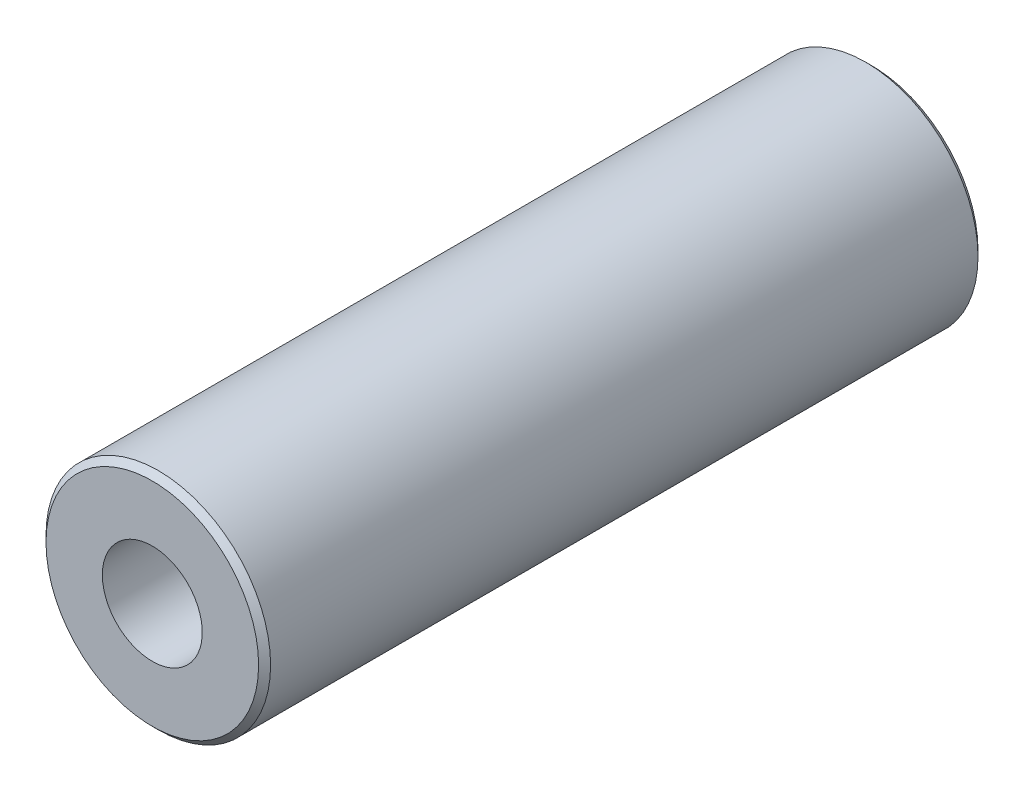
ISO-10303-21;
HEADER;
FILE_DESCRIPTION(('STEP AP214'),'2;1');
FILE_NAME('part.step','',(''),(''),'','','');
FILE_SCHEMA(('AUTOMOTIVE_DESIGN { 1 0 10303 214 1 1 1 1 }'));
ENDSEC;
DATA;
#1=APPLICATION_CONTEXT('core data for automotive mechanical design processes');
#2=APPLICATION_PROTOCOL_DEFINITION('international standard','automotive_design',2000,#1);
#3=PRODUCT_CONTEXT('',#1,'mechanical');
#4=PRODUCT('Part','Part','',(#3));
#5=PRODUCT_RELATED_PRODUCT_CATEGORY('part','',(#4));
#6=PRODUCT_DEFINITION_FORMATION('','',#4);
#7=PRODUCT_DEFINITION_CONTEXT('part definition',#1,'design');
#8=PRODUCT_DEFINITION('design','',#6,#7);
#9=PRODUCT_DEFINITION_SHAPE('','',#8);
#10=(LENGTH_UNIT() NAMED_UNIT(*) SI_UNIT(.MILLI.,.METRE.));
#11=(NAMED_UNIT(*) PLANE_ANGLE_UNIT() SI_UNIT($,.RADIAN.));
#12=(NAMED_UNIT(*) SI_UNIT($,.STERADIAN.) SOLID_ANGLE_UNIT());
#13=UNCERTAINTY_MEASURE_WITH_UNIT(LENGTH_MEASURE(1.E-05),#10,'distance_accuracy_value','');
#14=(GEOMETRIC_REPRESENTATION_CONTEXT(3) GLOBAL_UNCERTAINTY_ASSIGNED_CONTEXT((#13)) GLOBAL_UNIT_ASSIGNED_CONTEXT((#10,
#11,#12)) REPRESENTATION_CONTEXT('',''));
#15=CARTESIAN_POINT('',(0.,0.,0.));
#16=DIRECTION('',(0.,0.,1.));
#17=DIRECTION('',(1.,0.,0.));
#18=AXIS2_PLACEMENT_3D('',#15,#16,#17);
#19=CARTESIAN_POINT('',(0.,0.,22.86));
#20=DIRECTION('',(0.,0.,0.999999999999999));
#21=DIRECTION('',(0.999999999999998,0.,0.));
#22=AXIS2_PLACEMENT_3D('',#19,#20,#21);
#23=PLANE('',#22);
#24=CARTESIAN_POINT('',(0.,0.,22.86));
#25=DIRECTION('',(0.,0.,0.999999999999999));
#26=DIRECTION('',(0.999999999999998,0.,0.));
#27=AXIS2_PLACEMENT_3D('',#24,#25,#26);
#28=CIRCLE('',#27,6.75640000000001);
#29=CARTESIAN_POINT('',(-6.7564,0.,22.86));
#30=VERTEX_POINT('',#29);
#31=EDGE_CURVE('E10',#30,#30,#28,.T.);
#32=ORIENTED_EDGE('',*,*,#31,.T.);
#33=EDGE_LOOP('',(#32));
#34=FACE_BOUND('',#33,.T.);
#35=CARTESIAN_POINT('',(0.,0.,22.86));
#36=DIRECTION('',(0.,0.,0.999999999999999));
#37=DIRECTION('',(0.999999999999998,0.,0.));
#38=AXIS2_PLACEMENT_3D('',#35,#36,#37);
#39=CIRCLE('',#38,3.175);
#40=CARTESIAN_POINT('',(-3.17499999999999,0.,22.86));
#41=VERTEX_POINT('',#40);
#42=EDGE_CURVE('E54',#41,#41,#39,.T.);
#43=ORIENTED_EDGE('',*,*,#42,.F.);
#44=EDGE_LOOP('',(#43));
#45=FACE_BOUND('',#44,.T.);
#46=ADVANCED_FACE('F34',(#34,#45),#23,.T.);
#47=CARTESIAN_POINT('',(0.,0.,-22.86));
#48=DIRECTION('',(0.,0.,0.999999999999999));
#49=DIRECTION('',(0.999999999999998,0.,0.));
#50=AXIS2_PLACEMENT_3D('',#47,#48,#49);
#51=PLANE('',#50);
#52=CARTESIAN_POINT('',(0.,0.,-22.86));
#53=DIRECTION('',(0.,0.,0.999999999999999));
#54=DIRECTION('',(0.999999999999998,0.,0.));
#55=AXIS2_PLACEMENT_3D('',#52,#53,#54);
#56=CIRCLE('',#55,6.7564);
#57=CARTESIAN_POINT('',(6.75639999999999,0.,-22.86));
#58=VERTEX_POINT('',#57);
#59=EDGE_CURVE('E41',#58,#58,#56,.F.);
#60=ORIENTED_EDGE('',*,*,#59,.T.);
#61=EDGE_LOOP('',(#60));
#62=FACE_BOUND('',#61,.T.);
#63=CARTESIAN_POINT('',(0.,0.,-22.86));
#64=DIRECTION('',(0.,0.,0.999999999999999));
#65=DIRECTION('',(0.999999999999998,0.,0.));
#66=AXIS2_PLACEMENT_3D('',#63,#64,#65);
#67=CIRCLE('',#66,3.175);
#68=CARTESIAN_POINT('',(-3.17499999999999,0.,-22.86));
#69=VERTEX_POINT('',#68);
#70=EDGE_CURVE('E55',#69,#69,#67,.T.);
#71=ORIENTED_EDGE('',*,*,#70,.T.);
#72=EDGE_LOOP('',(#71));
#73=FACE_BOUND('',#72,.T.);
#74=ADVANCED_FACE('F65',(#62,#73),#51,.F.);
#75=CARTESIAN_POINT('',(0.,0.,22.86));
#76=DIRECTION('',(0.,0.,-0.999999999999999));
#77=DIRECTION('',(-0.999999999999998,0.,0.));
#78=AXIS2_PLACEMENT_3D('',#75,#76,#77);
#79=CYLINDRICAL_SURFACE('',#78,7.1374);
#80=CARTESIAN_POINT('',(0.,0.,-22.479));
#81=DIRECTION('',(0.,0.,0.999999999999999));
#82=DIRECTION('',(0.999999999999998,0.,0.));
#83=AXIS2_PLACEMENT_3D('',#80,#81,#82);
#84=CIRCLE('',#83,7.1374);
#85=CARTESIAN_POINT('',(-7.13739999999998,0.,-22.479));
#86=VERTEX_POINT('',#85);
#87=EDGE_CURVE('E45',#86,#86,#84,.T.);
#88=CARTESIAN_POINT('',(0.,0.,22.479));
#89=DIRECTION('',(0.,0.,0.999999999999999));
#90=DIRECTION('',(0.999999999999998,0.,0.));
#91=AXIS2_PLACEMENT_3D('',#88,#89,#90);
#92=CIRCLE('',#91,7.1374);
#93=CARTESIAN_POINT('',(-7.13739999999999,0.,22.479));
#94=VERTEX_POINT('',#93);
#95=EDGE_CURVE('E49',#94,#94,#92,.F.);
#96=CARTESIAN_POINT('',(-7.13739999999998,0.,-22.479));
#97=CARTESIAN_POINT('',(-7.13739999999998,0.,-22.0106875));
#98=CARTESIAN_POINT('',(-7.13739999999998,0.,-21.542375));
#99=CARTESIAN_POINT('',(-7.13739999999998,0.,-20.60575));
#100=CARTESIAN_POINT('',(-7.13739999999998,0.,-20.1374375));
#101=CARTESIAN_POINT('',(-7.13739999999998,0.,-19.2008125));
#102=CARTESIAN_POINT('',(-7.13739999999998,0.,-18.7325));
#103=CARTESIAN_POINT('',(-7.13739999999998,0.,-17.795875));
#104=CARTESIAN_POINT('',(-7.13739999999998,0.,-17.3275625));
#105=CARTESIAN_POINT('',(-7.13739999999998,0.,-16.3909375));
#106=CARTESIAN_POINT('',(-7.13739999999998,0.,-15.922625));
#107=CARTESIAN_POINT('',(-7.13739999999998,0.,-14.986));
#108=CARTESIAN_POINT('',(-7.13739999999998,0.,-14.5176875));
#109=CARTESIAN_POINT('',(-7.13739999999998,0.,-13.5810625));
#110=CARTESIAN_POINT('',(-7.13739999999998,0.,-13.11275));
#111=CARTESIAN_POINT('',(-7.13739999999998,0.,-12.176125));
#112=CARTESIAN_POINT('',(-7.13739999999998,0.,-11.7078125));
#113=CARTESIAN_POINT('',(-7.13739999999998,0.,-10.7711875));
#114=CARTESIAN_POINT('',(-7.13739999999998,0.,-10.302875));
#115=CARTESIAN_POINT('',(-7.13739999999998,0.,-9.36625));
#116=CARTESIAN_POINT('',(-7.13739999999998,0.,-8.8979375));
#117=CARTESIAN_POINT('',(-7.13739999999998,0.,-7.9613125));
#118=CARTESIAN_POINT('',(-7.13739999999998,0.,-7.49300000000001));
#119=CARTESIAN_POINT('',(-7.13739999999998,0.,-6.55637500000001));
#120=CARTESIAN_POINT('',(-7.13739999999998,0.,-6.08806250000001));
#121=CARTESIAN_POINT('',(-7.13739999999998,0.,-5.15143750000001));
#122=CARTESIAN_POINT('',(-7.13739999999998,0.,-4.68312500000001));
#123=CARTESIAN_POINT('',(-7.13739999999998,0.,-3.74650000000001));
#124=CARTESIAN_POINT('',(-7.13739999999998,0.,-3.27818750000001));
#125=CARTESIAN_POINT('',(-7.13739999999998,0.,-2.34156250000001));
#126=CARTESIAN_POINT('',(-7.13739999999998,0.,-1.87325000000001));
#127=CARTESIAN_POINT('',(-7.13739999999998,0.,-0.936625000000013));
#128=CARTESIAN_POINT('',(-7.13739999999998,0.,-0.468312500000013));
#129=CARTESIAN_POINT('',(-7.13739999999998,0.,0.468312499999987));
#130=CARTESIAN_POINT('',(-7.13739999999998,0.,0.936624999999987));
#131=CARTESIAN_POINT('',(-7.13739999999998,0.,1.87324999999999));
#132=CARTESIAN_POINT('',(-7.13739999999998,0.,2.34156249999999));
#133=CARTESIAN_POINT('',(-7.13739999999998,0.,3.27818749999999));
#134=CARTESIAN_POINT('',(-7.13739999999999,0.,3.74649999999999));
#135=CARTESIAN_POINT('',(-7.13739999999999,0.,4.68312499999998));
#136=CARTESIAN_POINT('',(-7.13739999999999,0.,5.15143749999998));
#137=CARTESIAN_POINT('',(-7.13739999999999,0.,6.08806249999998));
#138=CARTESIAN_POINT('',(-7.13739999999999,0.,6.55637499999998));
#139=CARTESIAN_POINT('',(-7.13739999999999,0.,7.49299999999998));
#140=CARTESIAN_POINT('',(-7.13739999999999,0.,7.96131249999998));
#141=CARTESIAN_POINT('',(-7.13739999999999,0.,8.89793749999998));
#142=CARTESIAN_POINT('',(-7.13739999999999,0.,9.36624999999998));
#143=CARTESIAN_POINT('',(-7.13739999999999,0.,10.302875));
#144=CARTESIAN_POINT('',(-7.13739999999999,0.,10.7711875));
#145=CARTESIAN_POINT('',(-7.13739999999999,0.,11.7078125));
#146=CARTESIAN_POINT('',(-7.13739999999999,0.,12.176125));
#147=CARTESIAN_POINT('',(-7.13739999999999,0.,13.11275));
#148=CARTESIAN_POINT('',(-7.13739999999999,0.,13.5810625));
#149=CARTESIAN_POINT('',(-7.13739999999999,0.,14.5176875));
#150=CARTESIAN_POINT('',(-7.13739999999999,0.,14.986));
#151=CARTESIAN_POINT('',(-7.13739999999999,0.,15.922625));
#152=CARTESIAN_POINT('',(-7.13739999999999,0.,16.3909375));
#153=CARTESIAN_POINT('',(-7.13739999999999,0.,17.3275625));
#154=CARTESIAN_POINT('',(-7.13739999999999,0.,17.795875));
#155=CARTESIAN_POINT('',(-7.13739999999999,0.,18.7325));
#156=CARTESIAN_POINT('',(-7.13739999999999,0.,19.2008125));
#157=CARTESIAN_POINT('',(-7.13739999999999,0.,20.1374375));
#158=CARTESIAN_POINT('',(-7.13739999999999,0.,20.60575));
#159=CARTESIAN_POINT('',(-7.13739999999999,0.,21.542375));
#160=CARTESIAN_POINT('',(-7.13739999999999,0.,22.0106875));
#161=CARTESIAN_POINT('',(-7.13739999999999,0.,22.479));
#162=B_SPLINE_CURVE_WITH_KNOTS('',3,(#96,#97,#98,#99,#100,#101,#102,#103,#104,#105,#106,#107,
#108,#109,#110,#111,#112,#113,#114,#115,#116,#117,#118,#119,#120,#121,#122,#123,#124,#125,#126,
#127,#128,#129,#130,#131,#132,#133,#134,#135,#136,#137,#138,#139,#140,#141,#142,#143,#144,#145,
#146,#147,#148,#149,#150,#151,#152,#153,#154,#155,#156,#157,#158,#159,#160,#161),.UNSPECIFIED.,
.F.,.F.,(4,2,2,2,2,2,2,2,2,2,2,2,2,2,2,2,2,2,2,2,2,2,2,2,2,2,2,2,2,2,2,2,4),(0.,1.4049375,
2.809875,4.2148125,5.61975,7.02468749999999,8.42962499999999,9.83456249999999,11.2395,
12.6444375,14.049375,15.4543125,16.85925,18.2641875,19.669125,21.0740625,22.479,23.8839375,
25.288875,26.6938125,28.09875,29.5036875,30.908625,32.3135625,33.7185,35.1234375,36.528375,
37.9333125,39.33825,40.7431875,42.148125,43.5530625,44.958),.UNSPECIFIED.);
#163=EDGE_CURVE('BSEAM70',#86,#94,#162,.T.);
#164=ORIENTED_EDGE('',*,*,#87,.T.);
#165=ORIENTED_EDGE('',*,*,#95,.T.);
#166=ORIENTED_EDGE('',*,*,#163,.T.);
#167=ORIENTED_EDGE('',*,*,#163,.F.);
#168=EDGE_LOOP('',(#164,#166,#165,#167));
#169=FACE_BOUND('',#168,.T.);
#170=ADVANCED_FACE('F70',(#169),#79,.T.);
#171=CARTESIAN_POINT('',(0.,0.,22.86));
#172=DIRECTION('',(0.,0.,-0.999999999999999));
#173=DIRECTION('',(-0.999999999999998,0.,0.));
#174=AXIS2_PLACEMENT_3D('',#171,#172,#173);
#175=CYLINDRICAL_SURFACE('',#174,3.175);
#176=CARTESIAN_POINT('',(-3.17499999999999,0.,22.86));
#177=CARTESIAN_POINT('',(-3.17499999999999,0.,22.38375));
#178=CARTESIAN_POINT('',(-3.17499999999999,0.,21.9075));
#179=CARTESIAN_POINT('',(-3.17499999999999,0.,20.955));
#180=CARTESIAN_POINT('',(-3.17499999999999,0.,20.47875));
#181=CARTESIAN_POINT('',(-3.17499999999999,0.,19.52625));
#182=CARTESIAN_POINT('',(-3.17499999999999,0.,19.05));
#183=CARTESIAN_POINT('',(-3.17499999999999,0.,18.0975));
#184=CARTESIAN_POINT('',(-3.17499999999999,0.,17.62125));
#185=CARTESIAN_POINT('',(-3.17499999999999,0.,16.66875));
#186=CARTESIAN_POINT('',(-3.17499999999999,0.,16.1925));
#187=CARTESIAN_POINT('',(-3.17499999999999,0.,15.24));
#188=CARTESIAN_POINT('',(-3.17499999999999,0.,14.76375));
#189=CARTESIAN_POINT('',(-3.17499999999999,0.,13.81125));
#190=CARTESIAN_POINT('',(-3.17499999999999,0.,13.335));
#191=CARTESIAN_POINT('',(-3.17499999999999,0.,12.3825));
#192=CARTESIAN_POINT('',(-3.17499999999999,0.,11.90625));
#193=CARTESIAN_POINT('',(-3.17499999999999,0.,10.95375));
#194=CARTESIAN_POINT('',(-3.17499999999999,0.,10.4775));
#195=CARTESIAN_POINT('',(-3.17499999999999,0.,9.52499999999998));
#196=CARTESIAN_POINT('',(-3.17499999999999,0.,9.04874999999998));
#197=CARTESIAN_POINT('',(-3.17499999999999,0.,8.09624999999999));
#198=CARTESIAN_POINT('',(-3.17499999999999,0.,7.61999999999999));
#199=CARTESIAN_POINT('',(-3.17499999999999,0.,6.66749999999999));
#200=CARTESIAN_POINT('',(-3.17499999999999,0.,6.19124999999999));
#201=CARTESIAN_POINT('',(-3.17499999999999,0.,5.23874999999999));
#202=CARTESIAN_POINT('',(-3.17499999999999,0.,4.76249999999999));
#203=CARTESIAN_POINT('',(-3.17499999999999,0.,3.81));
#204=CARTESIAN_POINT('',(-3.17499999999999,0.,3.33375));
#205=CARTESIAN_POINT('',(-3.17499999999999,0.,2.38125));
#206=CARTESIAN_POINT('',(-3.17499999999999,0.,1.905));
#207=CARTESIAN_POINT('',(-3.17499999999999,0.,0.9525));
#208=CARTESIAN_POINT('',(-3.17499999999999,0.,0.47625));
#209=CARTESIAN_POINT('',(-3.17499999999999,0.,-0.476249999999999));
#210=CARTESIAN_POINT('',(-3.17499999999999,0.,-0.952499999999997));
#211=CARTESIAN_POINT('',(-3.17499999999999,0.,-1.905));
#212=CARTESIAN_POINT('',(-3.17499999999999,0.,-2.38125));
#213=CARTESIAN_POINT('',(-3.17499999999999,0.,-3.33374999999999));
#214=CARTESIAN_POINT('',(-3.17499999999999,0.,-3.80999999999999));
#215=CARTESIAN_POINT('',(-3.17499999999999,0.,-4.76249999999999));
#216=CARTESIAN_POINT('',(-3.17499999999999,0.,-5.23874999999999));
#217=CARTESIAN_POINT('',(-3.17499999999999,0.,-6.19124999999999));
#218=CARTESIAN_POINT('',(-3.17499999999999,0.,-6.66749999999999));
#219=CARTESIAN_POINT('',(-3.17499999999999,0.,-7.61999999999999));
#220=CARTESIAN_POINT('',(-3.17499999999999,0.,-8.09624999999998));
#221=CARTESIAN_POINT('',(-3.17499999999999,0.,-9.04874999999998));
#222=CARTESIAN_POINT('',(-3.17499999999999,0.,-9.52499999999998));
#223=CARTESIAN_POINT('',(-3.17499999999999,0.,-10.4775));
#224=CARTESIAN_POINT('',(-3.17499999999999,0.,-10.95375));
#225=CARTESIAN_POINT('',(-3.17499999999999,0.,-11.90625));
#226=CARTESIAN_POINT('',(-3.17499999999999,0.,-12.3825));
#227=CARTESIAN_POINT('',(-3.17499999999999,0.,-13.335));
#228=CARTESIAN_POINT('',(-3.17499999999999,0.,-13.81125));
#229=CARTESIAN_POINT('',(-3.17499999999999,0.,-14.76375));
#230=CARTESIAN_POINT('',(-3.17499999999999,0.,-15.24));
#231=CARTESIAN_POINT('',(-3.17499999999999,0.,-16.1925));
#232=CARTESIAN_POINT('',(-3.17499999999999,0.,-16.66875));
#233=CARTESIAN_POINT('',(-3.17499999999999,0.,-17.62125));
#234=CARTESIAN_POINT('',(-3.17499999999999,0.,-18.0975));
#235=CARTESIAN_POINT('',(-3.17499999999999,0.,-19.05));
#236=CARTESIAN_POINT('',(-3.17499999999999,0.,-19.52625));
#237=CARTESIAN_POINT('',(-3.17499999999999,0.,-20.47875));
#238=CARTESIAN_POINT('',(-3.17499999999999,0.,-20.955));
#239=CARTESIAN_POINT('',(-3.17499999999999,0.,-21.9075));
#240=CARTESIAN_POINT('',(-3.17499999999999,0.,-22.38375));
#241=CARTESIAN_POINT('',(-3.17499999999999,0.,-22.86));
#242=B_SPLINE_CURVE_WITH_KNOTS('',3,(#176,#177,#178,#179,#180,#181,#182,#183,#184,#185,#186,
#187,#188,#189,#190,#191,#192,#193,#194,#195,#196,#197,#198,#199,#200,#201,#202,#203,#204,#205,
#206,#207,#208,#209,#210,#211,#212,#213,#214,#215,#216,#217,#218,#219,#220,#221,#222,#223,#224,
#225,#226,#227,#228,#229,#230,#231,#232,#233,#234,#235,#236,#237,#238,#239,#240,#241),
.UNSPECIFIED.,.F.,.F.,(4,2,2,2,2,2,2,2,2,2,2,2,2,2,2,2,2,2,2,2,2,2,2,2,2,2,2,2,2,2,2,2,4),(0.,
1.42875,2.8575,4.28624999999999,5.71499999999999,7.14374999999999,8.57249999999999,10.00125,
11.43,12.85875,14.2875,15.71625,17.145,18.57375,20.0025,21.43125,22.86,24.28875,25.7175,
27.14625,28.575,30.00375,31.4324999999999,32.8612499999999,34.2899999999999,35.7187499999999,
37.1474999999999,38.5762499999999,40.0049999999999,41.4337499999999,42.8624999999999,
44.2912499999999,45.7199999999999),.UNSPECIFIED.);
#243=EDGE_CURVE('BSEAM61',#41,#69,#242,.T.);
#244=ORIENTED_EDGE('',*,*,#42,.T.);
#245=ORIENTED_EDGE('',*,*,#70,.F.);
#246=ORIENTED_EDGE('',*,*,#243,.T.);
#247=ORIENTED_EDGE('',*,*,#243,.F.);
#248=EDGE_LOOP('',(#244,#246,#245,#247));
#249=FACE_BOUND('',#248,.T.);
#250=ADVANCED_FACE('F61',(#249),#175,.F.);
#251=CARTESIAN_POINT('',(0.,0.,-22.479));
#252=DIRECTION('',(0.,0.,0.999999999999999));
#253=DIRECTION('',(0.999999999999998,0.,0.));
#254=AXIS2_PLACEMENT_3D('',#251,#252,#253);
#255=CONICAL_SURFACE('',#254,7.1374,0.78539816339744);
#256=ORIENTED_EDGE('',*,*,#59,.F.);
#257=EDGE_LOOP('',(#256));
#258=FACE_BOUND('',#257,.T.);
#259=ORIENTED_EDGE('',*,*,#87,.F.);
#260=EDGE_LOOP('',(#259));
#261=FACE_BOUND('',#260,.T.);
#262=ADVANCED_FACE('F76',(#258,#261),#255,.T.);
#263=CARTESIAN_POINT('',(0.,0.,22.86));
#264=DIRECTION('',(0.,0.,-0.999999999999999));
#265=DIRECTION('',(-0.999999999999998,0.,0.));
#266=AXIS2_PLACEMENT_3D('',#263,#264,#265);
#267=CONICAL_SURFACE('',#266,6.75640000000001,0.785398163397451);
#268=CARTESIAN_POINT('',(-7.13739999999999,0.,22.479));
#269=CARTESIAN_POINT('',(-7.13343124999999,0.,22.48296875));
#270=CARTESIAN_POINT('',(-7.12946249999999,0.,22.4869375));
#271=CARTESIAN_POINT('',(-7.12152499999999,0.,22.494875));
#272=CARTESIAN_POINT('',(-7.11755624999999,0.,22.49884375));
#273=CARTESIAN_POINT('',(-7.10961874999999,0.,22.50678125));
#274=CARTESIAN_POINT('',(-7.10564999999999,0.,22.51075));
#275=CARTESIAN_POINT('',(-7.09771249999999,0.,22.5186875));
#276=CARTESIAN_POINT('',(-7.09374374999999,0.,22.52265625));
#277=CARTESIAN_POINT('',(-7.08580624999999,0.,22.53059375));
#278=CARTESIAN_POINT('',(-7.08183749999999,0.,22.5345625));
#279=CARTESIAN_POINT('',(-7.07389999999999,0.,22.5425));
#280=CARTESIAN_POINT('',(-7.06993124999999,0.,22.54646875));
#281=CARTESIAN_POINT('',(-7.06199374999999,0.,22.55440625));
#282=CARTESIAN_POINT('',(-7.05802499999999,0.,22.558375));
#283=CARTESIAN_POINT('',(-7.05008749999999,0.,22.5663125));
#284=CARTESIAN_POINT('',(-7.04611874999999,0.,22.57028125));
#285=CARTESIAN_POINT('',(-7.03818124999999,0.,22.57821875));
#286=CARTESIAN_POINT('',(-7.0342125,0.,22.5821875));
#287=CARTESIAN_POINT('',(-7.02627499999999,0.,22.590125));
#288=CARTESIAN_POINT('',(-7.02230624999999,0.,22.59409375));
#289=CARTESIAN_POINT('',(-7.01436875,0.,22.60203125));
#290=CARTESIAN_POINT('',(-7.01039999999999,0.,22.606));
#291=CARTESIAN_POINT('',(-7.0024625,0.,22.6139375));
#292=CARTESIAN_POINT('',(-6.99849375,0.,22.61790625));
#293=CARTESIAN_POINT('',(-6.99055624999999,0.,22.62584375));
#294=CARTESIAN_POINT('',(-6.9865875,0.,22.6298125));
#295=CARTESIAN_POINT('',(-6.97865,0.,22.63775));
#296=CARTESIAN_POINT('',(-6.97468125,0.,22.64171875));
#297=CARTESIAN_POINT('',(-6.96674375,0.,22.64965625));
#298=CARTESIAN_POINT('',(-6.962775,0.,22.653625));
#299=CARTESIAN_POINT('',(-6.9548375,0.,22.6615625));
#300=CARTESIAN_POINT('',(-6.95086875,0.,22.66553125));
#301=CARTESIAN_POINT('',(-6.94293125,0.,22.67346875));
#302=CARTESIAN_POINT('',(-6.9389625,0.,22.6774375));
#303=CARTESIAN_POINT('',(-6.931025,0.,22.685375));
#304=CARTESIAN_POINT('',(-6.92705625,0.,22.68934375));
#305=CARTESIAN_POINT('',(-6.91911875,0.,22.69728125));
#306=CARTESIAN_POINT('',(-6.91515,0.,22.70125));
#307=CARTESIAN_POINT('',(-6.9072125,0.,22.7091875));
#308=CARTESIAN_POINT('',(-6.90324375,0.,22.71315625));
#309=CARTESIAN_POINT('',(-6.89530625,0.,22.72109375));
#310=CARTESIAN_POINT('',(-6.8913375,0.,22.7250625));
#311=CARTESIAN_POINT('',(-6.8834,0.,22.733));
#312=CARTESIAN_POINT('',(-6.87943125,0.,22.73696875));
#313=CARTESIAN_POINT('',(-6.87149375,0.,22.74490625));
#314=CARTESIAN_POINT('',(-6.867525,0.,22.748875));
#315=CARTESIAN_POINT('',(-6.8595875,0.,22.7568125));
#316=CARTESIAN_POINT('',(-6.85561875,0.,22.76078125));
#317=CARTESIAN_POINT('',(-6.84768125,0.,22.76871875));
#318=CARTESIAN_POINT('',(-6.8437125,0.,22.7726875));
#319=CARTESIAN_POINT('',(-6.835775,0.,22.780625));
#320=CARTESIAN_POINT('',(-6.83180625,0.,22.78459375));
#321=CARTESIAN_POINT('',(-6.82386875,0.,22.79253125));
#322=CARTESIAN_POINT('',(-6.8199,0.,22.7965));
#323=CARTESIAN_POINT('',(-6.8119625,0.,22.8044375));
#324=CARTESIAN_POINT('',(-6.80799375,0.,22.80840625));
#325=CARTESIAN_POINT('',(-6.80005625,0.,22.81634375));
#326=CARTESIAN_POINT('',(-6.7960875,0.,22.8203125));
#327=CARTESIAN_POINT('',(-6.78815,0.,22.82825));
#328=CARTESIAN_POINT('',(-6.78418125,0.,22.83221875));
#329=CARTESIAN_POINT('',(-6.77624375,0.,22.84015625));
#330=CARTESIAN_POINT('',(-6.772275,0.,22.844125));
#331=CARTESIAN_POINT('',(-6.7643375,0.,22.8520625));
#332=CARTESIAN_POINT('',(-6.76036875,0.,22.85603125));
#333=CARTESIAN_POINT('',(-6.7564,0.,22.86));
#334=B_SPLINE_CURVE_WITH_KNOTS('',3,(#268,#269,#270,#271,#272,#273,#274,#275,#276,#277,#278,
#279,#280,#281,#282,#283,#284,#285,#286,#287,#288,#289,#290,#291,#292,#293,#294,#295,#296,#297,
#298,#299,#300,#301,#302,#303,#304,#305,#306,#307,#308,#309,#310,#311,#312,#313,#314,#315,#316,
#317,#318,#319,#320,#321,#322,#323,#324,#325,#326,#327,#328,#329,#330,#331,#332,#333),
.UNSPECIFIED.,.F.,.F.,(4,2,2,2,2,2,2,2,2,2,2,2,2,2,2,2,2,2,2,2,2,2,2,2,2,2,2,2,2,2,2,2,4),(0.,
0.0168379802270062,0.0336759604540105,0.0505139406810142,0.0673519209080179,0.0841899011350241,
0.101027881362028,0.117865861589032,0.134703841816035,0.151541822043041,0.168379802270045,
0.185217782497049,0.202055762724053,0.218893742951059,0.235731723178062,0.252569703405066,
0.26940768363207,0.286245663859076,0.30308364408608,0.319921624313083,0.336759604540087,
0.353597584767093,0.370435564994097,0.387273545221101,0.404111525448107,0.420949505675111,
0.437787485902114,0.454625466129119,0.471463446356125,0.488301426583129,0.505139406810132,
0.521977387037136,0.538815367264142),.UNSPECIFIED.);
#335=EDGE_CURVE('BSEAM36',#94,#30,#334,.T.);
#336=ORIENTED_EDGE('',*,*,#95,.F.);
#337=ORIENTED_EDGE('',*,*,#31,.F.);
#338=ORIENTED_EDGE('',*,*,#335,.T.);
#339=ORIENTED_EDGE('',*,*,#335,.F.);
#340=EDGE_LOOP('',(#336,#338,#337,#339));
#341=FACE_BOUND('',#340,.T.);
#342=ADVANCED_FACE('F36',(#341),#267,.T.);
#343=CLOSED_SHELL('',(#46,#74,#170,#250,#262,#342));
#344=MANIFOLD_SOLID_BREP('B2',#343);
#345=ADVANCED_BREP_SHAPE_REPRESENTATION('',(#18,#344),#14);
#346=SHAPE_DEFINITION_REPRESENTATION(#9,#345);
ENDSEC;
END-ISO-10303-21;
